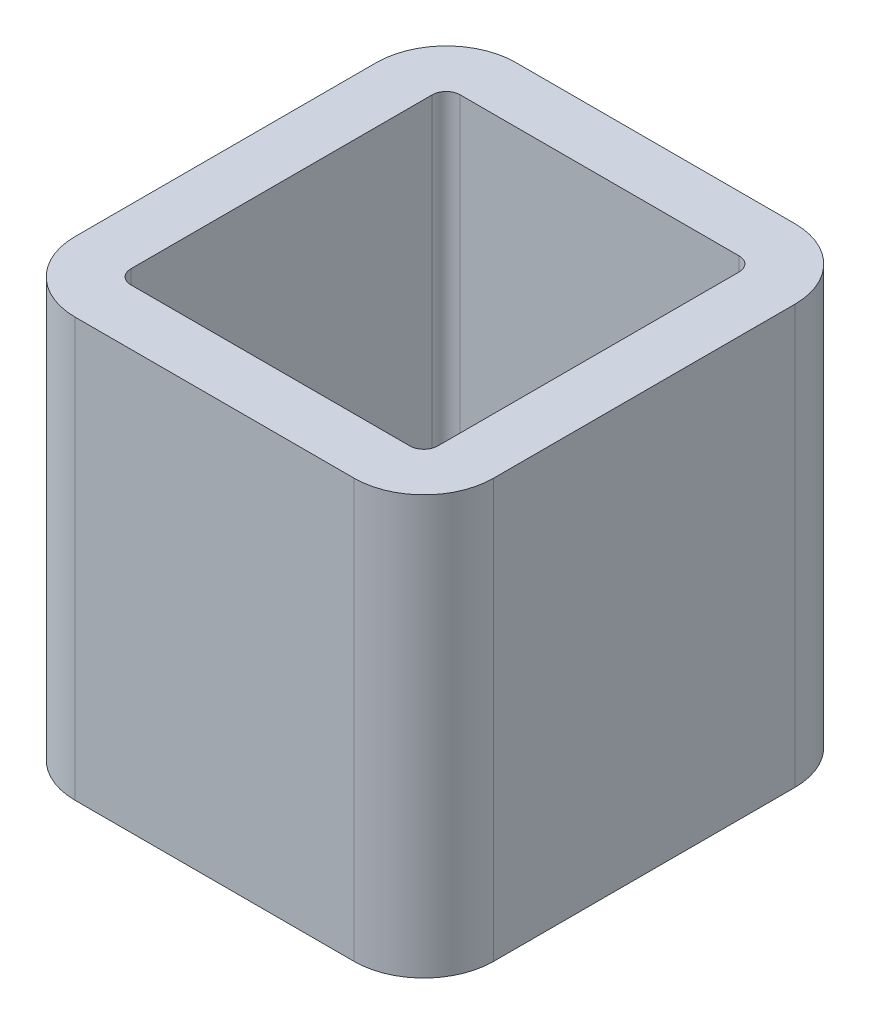
ISO-10303-21;
HEADER;
FILE_DESCRIPTION(('STEP AP214'),'2;1');
FILE_NAME('part.step','',(''),(''),'','','');
FILE_SCHEMA(('AUTOMOTIVE_DESIGN { 1 0 10303 214 1 1 1 1 }'));
ENDSEC;
DATA;
#1=APPLICATION_CONTEXT('core data for automotive mechanical design processes');
#2=APPLICATION_PROTOCOL_DEFINITION('international standard','automotive_design',2000,#1);
#3=PRODUCT_CONTEXT('',#1,'mechanical');
#4=PRODUCT('Part','Part','',(#3));
#5=PRODUCT_RELATED_PRODUCT_CATEGORY('part','',(#4));
#6=PRODUCT_DEFINITION_FORMATION('','',#4);
#7=PRODUCT_DEFINITION_CONTEXT('part definition',#1,'design');
#8=PRODUCT_DEFINITION('design','',#6,#7);
#9=PRODUCT_DEFINITION_SHAPE('','',#8);
#10=(LENGTH_UNIT() NAMED_UNIT(*) SI_UNIT(.MILLI.,.METRE.));
#11=(NAMED_UNIT(*) PLANE_ANGLE_UNIT() SI_UNIT($,.RADIAN.));
#12=(NAMED_UNIT(*) SI_UNIT($,.STERADIAN.) SOLID_ANGLE_UNIT());
#13=UNCERTAINTY_MEASURE_WITH_UNIT(LENGTH_MEASURE(1.E-05),#10,'distance_accuracy_value','');
#14=(GEOMETRIC_REPRESENTATION_CONTEXT(3) GLOBAL_UNCERTAINTY_ASSIGNED_CONTEXT((#13)) GLOBAL_UNIT_ASSIGNED_CONTEXT((#10,
#11,#12)) REPRESENTATION_CONTEXT('',''));
#15=CARTESIAN_POINT('',(0.,0.,0.));
#16=DIRECTION('',(0.,0.,1.));
#17=DIRECTION('',(1.,0.,0.));
#18=AXIS2_PLACEMENT_3D('',#15,#16,#17);
#19=CARTESIAN_POINT('',(0.,0.,0.));
#20=DIRECTION('',(0.,1.,0.));
#21=DIRECTION('',(0.,0.,1.));
#22=AXIS2_PLACEMENT_3D('',#19,#20,#21);
#23=PLANE('',#22);
#24=DIRECTION('',(0.,0.,1.));
#25=VECTOR('',#24,1.);
#26=CARTESIAN_POINT('',(-150.,0.,-158.));
#27=LINE('',#26,#25);
#28=CARTESIAN_POINT('',(-150.,0.,-108.));
#29=VERTEX_POINT('',#28);
#30=CARTESIAN_POINT('',(-150.,0.,108.));
#31=VERTEX_POINT('',#30);
#32=EDGE_CURVE('E254',#29,#31,#27,.T.);
#33=ORIENTED_EDGE('',*,*,#32,.F.);
#34=CARTESIAN_POINT('',(-100.,0.,-108.));
#35=DIRECTION('',(0.,1.,0.));
#36=DIRECTION('',(0.,0.,1.));
#37=AXIS2_PLACEMENT_3D('',#34,#35,#36);
#38=CIRCLE('',#37,50.);
#39=CARTESIAN_POINT('',(-100.,0.,-158.));
#40=VERTEX_POINT('',#39);
#41=EDGE_CURVE('E285',#29,#40,#38,.F.);
#42=ORIENTED_EDGE('',*,*,#41,.T.);
#43=DIRECTION('',(-1.,0.,0.));
#44=VECTOR('',#43,1.);
#45=CARTESIAN_POINT('',(-150.,0.,-158.));
#46=LINE('',#45,#44);
#47=CARTESIAN_POINT('',(100.,0.,-158.));
#48=VERTEX_POINT('',#47);
#49=EDGE_CURVE('E241',#48,#40,#46,.T.);
#50=ORIENTED_EDGE('',*,*,#49,.F.);
#51=CARTESIAN_POINT('',(100.,0.,-108.));
#52=DIRECTION('',(0.,1.,0.));
#53=DIRECTION('',(0.,0.,1.));
#54=AXIS2_PLACEMENT_3D('',#51,#52,#53);
#55=CIRCLE('',#54,50.);
#56=CARTESIAN_POINT('',(150.,0.,-108.));
#57=VERTEX_POINT('',#56);
#58=EDGE_CURVE('E282',#48,#57,#55,.F.);
#59=ORIENTED_EDGE('',*,*,#58,.T.);
#60=DIRECTION('',(0.,0.,-1.));
#61=VECTOR('',#60,1.);
#62=CARTESIAN_POINT('',(150.,0.,-158.));
#63=LINE('',#62,#61);
#64=CARTESIAN_POINT('',(150.,0.,108.));
#65=VERTEX_POINT('',#64);
#66=EDGE_CURVE('E263',#65,#57,#63,.T.);
#67=ORIENTED_EDGE('',*,*,#66,.F.);
#68=CARTESIAN_POINT('',(100.,0.,108.));
#69=DIRECTION('',(0.,1.,0.));
#70=DIRECTION('',(0.,0.,1.));
#71=AXIS2_PLACEMENT_3D('',#68,#69,#70);
#72=CIRCLE('',#71,50.);
#73=CARTESIAN_POINT('',(100.,0.,158.));
#74=VERTEX_POINT('',#73);
#75=EDGE_CURVE('E276',#65,#74,#72,.F.);
#76=ORIENTED_EDGE('',*,*,#75,.T.);
#77=DIRECTION('',(1.,0.,0.));
#78=VECTOR('',#77,1.);
#79=CARTESIAN_POINT('',(-150.,0.,158.));
#80=LINE('',#79,#78);
#81=CARTESIAN_POINT('',(-100.,0.,158.));
#82=VERTEX_POINT('',#81);
#83=EDGE_CURVE('E258',#82,#74,#80,.T.);
#84=ORIENTED_EDGE('',*,*,#83,.F.);
#85=CARTESIAN_POINT('',(-100.,0.,108.));
#86=DIRECTION('',(0.,1.,0.));
#87=DIRECTION('',(0.,0.,1.));
#88=AXIS2_PLACEMENT_3D('',#85,#86,#87);
#89=CIRCLE('',#88,50.);
#90=EDGE_CURVE('E279',#82,#31,#89,.F.);
#91=ORIENTED_EDGE('',*,*,#90,.T.);
#92=EDGE_LOOP('',(#33,#42,#50,#59,#67,#76,#84,#91));
#93=FACE_BOUND('',#92,.T.);
#94=CARTESIAN_POINT('',(-100.,0.,-108.));
#95=DIRECTION('',(0.,1.,0.));
#96=DIRECTION('',(0.,0.,1.));
#97=AXIS2_PLACEMENT_3D('',#94,#95,#96);
#98=CIRCLE('',#97,10.);
#99=CARTESIAN_POINT('',(-110.,0.,-108.));
#100=VERTEX_POINT('',#99);
#101=CARTESIAN_POINT('',(-100.,0.,-118.));
#102=VERTEX_POINT('',#101);
#103=EDGE_CURVE('E215',#100,#102,#98,.F.);
#104=ORIENTED_EDGE('',*,*,#103,.F.);
#105=DIRECTION('',(0.,0.,1.));
#106=VECTOR('',#105,1.);
#107=CARTESIAN_POINT('',(-110.,0.,-158.));
#108=LINE('',#107,#106);
#109=CARTESIAN_POINT('',(-110.,0.,108.));
#110=VERTEX_POINT('',#109);
#111=EDGE_CURVE('E212',#100,#110,#108,.T.);
#112=ORIENTED_EDGE('',*,*,#111,.T.);
#113=CARTESIAN_POINT('',(-100.,0.,108.));
#114=DIRECTION('',(0.,1.,0.));
#115=DIRECTION('',(0.,0.,1.));
#116=AXIS2_PLACEMENT_3D('',#113,#114,#115);
#117=CIRCLE('',#116,10.);
#118=CARTESIAN_POINT('',(-100.,0.,118.));
#119=VERTEX_POINT('',#118);
#120=EDGE_CURVE('E166',#119,#110,#117,.F.);
#121=ORIENTED_EDGE('',*,*,#120,.F.);
#122=DIRECTION('',(1.,0.,0.));
#123=VECTOR('',#122,1.);
#124=CARTESIAN_POINT('',(-150.,0.,118.));
#125=LINE('',#124,#123);
#126=CARTESIAN_POINT('',(100.,0.,118.));
#127=VERTEX_POINT('',#126);
#128=EDGE_CURVE('E67',#119,#127,#125,.T.);
#129=ORIENTED_EDGE('',*,*,#128,.T.);
#130=CARTESIAN_POINT('',(100.,0.,108.));
#131=DIRECTION('',(0.,1.,0.));
#132=DIRECTION('',(0.,0.,1.));
#133=AXIS2_PLACEMENT_3D('',#130,#131,#132);
#134=CIRCLE('',#133,10.);
#135=CARTESIAN_POINT('',(110.,0.,108.));
#136=VERTEX_POINT('',#135);
#137=EDGE_CURVE('E229',#136,#127,#134,.F.);
#138=ORIENTED_EDGE('',*,*,#137,.F.);
#139=DIRECTION('',(0.,0.,-1.));
#140=VECTOR('',#139,1.);
#141=CARTESIAN_POINT('',(110.,0.,-158.));
#142=LINE('',#141,#140);
#143=CARTESIAN_POINT('',(110.,0.,-108.));
#144=VERTEX_POINT('',#143);
#145=EDGE_CURVE('E223',#136,#144,#142,.T.);
#146=ORIENTED_EDGE('',*,*,#145,.T.);
#147=CARTESIAN_POINT('',(100.,0.,-108.));
#148=DIRECTION('',(0.,1.,0.));
#149=DIRECTION('',(0.,0.,1.));
#150=AXIS2_PLACEMENT_3D('',#147,#148,#149);
#151=CIRCLE('',#150,10.);
#152=CARTESIAN_POINT('',(100.,0.,-118.));
#153=VERTEX_POINT('',#152);
#154=EDGE_CURVE('E219',#153,#144,#151,.F.);
#155=ORIENTED_EDGE('',*,*,#154,.F.);
#156=DIRECTION('',(-1.,0.,0.));
#157=VECTOR('',#156,1.);
#158=CARTESIAN_POINT('',(-150.,0.,-118.));
#159=LINE('',#158,#157);
#160=EDGE_CURVE('E182',#153,#102,#159,.T.);
#161=ORIENTED_EDGE('',*,*,#160,.T.);
#162=EDGE_LOOP('',(#104,#112,#121,#129,#138,#146,#155,#161));
#163=FACE_BOUND('',#162,.T.);
#164=ADVANCED_FACE('F43',(#93,#163),#23,.F.);
#165=CARTESIAN_POINT('',(-150.,300.,-158.));
#166=DIRECTION('',(1.,0.,0.));
#167=DIRECTION('',(0.,0.,-1.));
#168=AXIS2_PLACEMENT_3D('',#165,#166,#167);
#169=PLANE('',#168);
#170=DIRECTION('',(0.,0.,1.));
#171=VECTOR('',#170,1.);
#172=CARTESIAN_POINT('',(-150.,300.,-158.));
#173=LINE('',#172,#171);
#174=CARTESIAN_POINT('',(-150.,300.,-108.));
#175=VERTEX_POINT('',#174);
#176=CARTESIAN_POINT('',(-150.,300.,108.));
#177=VERTEX_POINT('',#176);
#178=EDGE_CURVE('E236',#175,#177,#173,.T.);
#179=ORIENTED_EDGE('',*,*,#178,.F.);
#180=DIRECTION('',(0.,-1.,0.));
#181=VECTOR('',#180,1.);
#182=CARTESIAN_POINT('',(-150.,300.,-108.));
#183=LINE('',#182,#181);
#184=EDGE_CURVE('E272',#175,#29,#183,.T.);
#185=ORIENTED_EDGE('',*,*,#184,.T.);
#186=ORIENTED_EDGE('',*,*,#32,.T.);
#187=DIRECTION('',(0.,-1.,0.));
#188=VECTOR('',#187,1.);
#189=CARTESIAN_POINT('',(-150.,300.,108.));
#190=LINE('',#189,#188);
#191=EDGE_CURVE('E253',#31,#177,#190,.F.);
#192=ORIENTED_EDGE('',*,*,#191,.T.);
#193=EDGE_LOOP('',(#179,#185,#186,#192));
#194=FACE_BOUND('',#193,.T.);
#195=ADVANCED_FACE('F347',(#194),#169,.F.);
#196=CARTESIAN_POINT('',(-150.,300.,158.));
#197=DIRECTION('',(0.,0.,-1.));
#198=DIRECTION('',(-1.,0.,0.));
#199=AXIS2_PLACEMENT_3D('',#196,#197,#198);
#200=PLANE('',#199);
#201=DIRECTION('',(1.,0.,0.));
#202=VECTOR('',#201,1.);
#203=CARTESIAN_POINT('',(-150.,300.,158.));
#204=LINE('',#203,#202);
#205=CARTESIAN_POINT('',(-100.,300.,158.));
#206=VERTEX_POINT('',#205);
#207=CARTESIAN_POINT('',(100.,300.,158.));
#208=VERTEX_POINT('',#207);
#209=EDGE_CURVE('E240',#206,#208,#204,.T.);
#210=ORIENTED_EDGE('',*,*,#209,.F.);
#211=DIRECTION('',(0.,-1.,0.));
#212=VECTOR('',#211,1.);
#213=CARTESIAN_POINT('',(-100.,300.,158.));
#214=LINE('',#213,#212);
#215=EDGE_CURVE('E11',#206,#82,#214,.T.);
#216=ORIENTED_EDGE('',*,*,#215,.T.);
#217=ORIENTED_EDGE('',*,*,#83,.T.);
#218=DIRECTION('',(0.,-1.,0.));
#219=VECTOR('',#218,1.);
#220=CARTESIAN_POINT('',(100.,300.,158.));
#221=LINE('',#220,#219);
#222=EDGE_CURVE('E52',#74,#208,#221,.F.);
#223=ORIENTED_EDGE('',*,*,#222,.T.);
#224=EDGE_LOOP('',(#210,#216,#217,#223));
#225=FACE_BOUND('',#224,.T.);
#226=ADVANCED_FACE('F317',(#225),#200,.F.);
#227=CARTESIAN_POINT('',(150.,300.,-158.));
#228=DIRECTION('',(-1.,0.,0.));
#229=DIRECTION('',(0.,0.,1.));
#230=AXIS2_PLACEMENT_3D('',#227,#228,#229);
#231=PLANE('',#230);
#232=ORIENTED_EDGE('',*,*,#66,.T.);
#233=DIRECTION('',(0.,-1.,0.));
#234=VECTOR('',#233,1.);
#235=CARTESIAN_POINT('',(150.,300.,-108.));
#236=LINE('',#235,#234);
#237=CARTESIAN_POINT('',(150.,300.,-108.));
#238=VERTEX_POINT('',#237);
#239=EDGE_CURVE('E311',#57,#238,#236,.F.);
#240=ORIENTED_EDGE('',*,*,#239,.T.);
#241=DIRECTION('',(0.,0.,-1.));
#242=VECTOR('',#241,1.);
#243=CARTESIAN_POINT('',(150.,300.,-158.));
#244=LINE('',#243,#242);
#245=CARTESIAN_POINT('',(150.,300.,108.));
#246=VERTEX_POINT('',#245);
#247=EDGE_CURVE('E245',#246,#238,#244,.T.);
#248=ORIENTED_EDGE('',*,*,#247,.F.);
#249=DIRECTION('',(0.,-1.,0.));
#250=VECTOR('',#249,1.);
#251=CARTESIAN_POINT('',(150.,300.,108.));
#252=LINE('',#251,#250);
#253=EDGE_CURVE('E307',#246,#65,#252,.T.);
#254=ORIENTED_EDGE('',*,*,#253,.T.);
#255=EDGE_LOOP('',(#232,#240,#248,#254));
#256=FACE_BOUND('',#255,.T.);
#257=ADVANCED_FACE('F327',(#256),#231,.F.);
#258=CARTESIAN_POINT('',(-150.,300.,-158.));
#259=DIRECTION('',(0.,0.,1.));
#260=DIRECTION('',(1.,0.,0.));
#261=AXIS2_PLACEMENT_3D('',#258,#259,#260);
#262=PLANE('',#261);
#263=ORIENTED_EDGE('',*,*,#49,.T.);
#264=DIRECTION('',(0.,-1.,0.));
#265=VECTOR('',#264,1.);
#266=CARTESIAN_POINT('',(-100.,300.,-158.));
#267=LINE('',#266,#265);
#268=CARTESIAN_POINT('',(-100.,300.,-158.));
#269=VERTEX_POINT('',#268);
#270=EDGE_CURVE('E292',#40,#269,#267,.F.);
#271=ORIENTED_EDGE('',*,*,#270,.T.);
#272=DIRECTION('',(-1.,0.,0.));
#273=VECTOR('',#272,1.);
#274=CARTESIAN_POINT('',(-150.,300.,-158.));
#275=LINE('',#274,#273);
#276=CARTESIAN_POINT('',(100.,300.,-158.));
#277=VERTEX_POINT('',#276);
#278=EDGE_CURVE('E249',#277,#269,#275,.T.);
#279=ORIENTED_EDGE('',*,*,#278,.F.);
#280=DIRECTION('',(0.,-1.,0.));
#281=VECTOR('',#280,1.);
#282=CARTESIAN_POINT('',(100.,300.,-158.));
#283=LINE('',#282,#281);
#284=EDGE_CURVE('E288',#277,#48,#283,.T.);
#285=ORIENTED_EDGE('',*,*,#284,.T.);
#286=EDGE_LOOP('',(#263,#271,#279,#285));
#287=FACE_BOUND('',#286,.T.);
#288=ADVANCED_FACE('F339',(#287),#262,.F.);
#289=CARTESIAN_POINT('',(0.,300.,0.));
#290=DIRECTION('',(0.,1.,0.));
#291=DIRECTION('',(0.,0.,1.));
#292=AXIS2_PLACEMENT_3D('',#289,#290,#291);
#293=PLANE('',#292);
#294=DIRECTION('',(-1.,0.,0.));
#295=VECTOR('',#294,1.);
#296=CARTESIAN_POINT('',(-150.,300.,-118.));
#297=LINE('',#296,#295);
#298=CARTESIAN_POINT('',(100.,300.,-118.));
#299=VERTEX_POINT('',#298);
#300=CARTESIAN_POINT('',(-100.,300.,-118.));
#301=VERTEX_POINT('',#300);
#302=EDGE_CURVE('E172',#299,#301,#297,.T.);
#303=ORIENTED_EDGE('',*,*,#302,.F.);
#304=CARTESIAN_POINT('',(100.,300.,-108.));
#305=DIRECTION('',(0.,1.,0.));
#306=DIRECTION('',(0.,0.,1.));
#307=AXIS2_PLACEMENT_3D('',#304,#305,#306);
#308=CIRCLE('',#307,10.);
#309=CARTESIAN_POINT('',(110.,300.,-108.));
#310=VERTEX_POINT('',#309);
#311=EDGE_CURVE('E191',#310,#299,#308,.T.);
#312=ORIENTED_EDGE('',*,*,#311,.F.);
#313=DIRECTION('',(0.,0.,-1.));
#314=VECTOR('',#313,1.);
#315=CARTESIAN_POINT('',(110.,300.,-158.));
#316=LINE('',#315,#314);
#317=CARTESIAN_POINT('',(110.,300.,108.));
#318=VERTEX_POINT('',#317);
#319=EDGE_CURVE('E59',#318,#310,#316,.T.);
#320=ORIENTED_EDGE('',*,*,#319,.F.);
#321=CARTESIAN_POINT('',(100.,300.,108.));
#322=DIRECTION('',(0.,1.,0.));
#323=DIRECTION('',(0.,0.,1.));
#324=AXIS2_PLACEMENT_3D('',#321,#322,#323);
#325=CIRCLE('',#324,10.);
#326=CARTESIAN_POINT('',(100.,300.,118.));
#327=VERTEX_POINT('',#326);
#328=EDGE_CURVE('E192',#327,#318,#325,.T.);
#329=ORIENTED_EDGE('',*,*,#328,.F.);
#330=DIRECTION('',(1.,0.,0.));
#331=VECTOR('',#330,1.);
#332=CARTESIAN_POINT('',(-150.,300.,118.));
#333=LINE('',#332,#331);
#334=CARTESIAN_POINT('',(-100.,300.,118.));
#335=VERTEX_POINT('',#334);
#336=EDGE_CURVE('E181',#335,#327,#333,.T.);
#337=ORIENTED_EDGE('',*,*,#336,.F.);
#338=CARTESIAN_POINT('',(-100.,300.,108.));
#339=DIRECTION('',(0.,1.,0.));
#340=DIRECTION('',(0.,0.,1.));
#341=AXIS2_PLACEMENT_3D('',#338,#339,#340);
#342=CIRCLE('',#341,10.);
#343=CARTESIAN_POINT('',(-110.,300.,108.));
#344=VERTEX_POINT('',#343);
#345=EDGE_CURVE('E164',#344,#335,#342,.T.);
#346=ORIENTED_EDGE('',*,*,#345,.F.);
#347=DIRECTION('',(0.,0.,1.));
#348=VECTOR('',#347,1.);
#349=CARTESIAN_POINT('',(-110.,300.,-158.));
#350=LINE('',#349,#348);
#351=CARTESIAN_POINT('',(-110.,300.,-108.));
#352=VERTEX_POINT('',#351);
#353=EDGE_CURVE('E176',#352,#344,#350,.T.);
#354=ORIENTED_EDGE('',*,*,#353,.F.);
#355=CARTESIAN_POINT('',(-100.,300.,-108.));
#356=DIRECTION('',(0.,1.,0.));
#357=DIRECTION('',(0.,0.,1.));
#358=AXIS2_PLACEMENT_3D('',#355,#356,#357);
#359=CIRCLE('',#358,10.);
#360=EDGE_CURVE('E196',#301,#352,#359,.T.);
#361=ORIENTED_EDGE('',*,*,#360,.F.);
#362=EDGE_LOOP('',(#303,#312,#320,#329,#337,#346,#354,#361));
#363=FACE_BOUND('',#362,.T.);
#364=ORIENTED_EDGE('',*,*,#278,.T.);
#365=CARTESIAN_POINT('',(-100.,300.,-108.));
#366=DIRECTION('',(0.,1.,0.));
#367=DIRECTION('',(0.,0.,1.));
#368=AXIS2_PLACEMENT_3D('',#365,#366,#367);
#369=CIRCLE('',#368,50.);
#370=EDGE_CURVE('E304',#269,#175,#369,.T.);
#371=ORIENTED_EDGE('',*,*,#370,.T.);
#372=ORIENTED_EDGE('',*,*,#178,.T.);
#373=CARTESIAN_POINT('',(-100.,300.,108.));
#374=DIRECTION('',(0.,1.,0.));
#375=DIRECTION('',(0.,0.,1.));
#376=AXIS2_PLACEMENT_3D('',#373,#374,#375);
#377=CIRCLE('',#376,50.);
#378=EDGE_CURVE('E298',#177,#206,#377,.T.);
#379=ORIENTED_EDGE('',*,*,#378,.T.);
#380=ORIENTED_EDGE('',*,*,#209,.T.);
#381=CARTESIAN_POINT('',(100.,300.,108.));
#382=DIRECTION('',(0.,1.,0.));
#383=DIRECTION('',(0.,0.,1.));
#384=AXIS2_PLACEMENT_3D('',#381,#382,#383);
#385=CIRCLE('',#384,50.);
#386=EDGE_CURVE('E295',#208,#246,#385,.T.);
#387=ORIENTED_EDGE('',*,*,#386,.T.);
#388=ORIENTED_EDGE('',*,*,#247,.T.);
#389=CARTESIAN_POINT('',(100.,300.,-108.));
#390=DIRECTION('',(0.,1.,0.));
#391=DIRECTION('',(0.,0.,1.));
#392=AXIS2_PLACEMENT_3D('',#389,#390,#391);
#393=CIRCLE('',#392,50.);
#394=EDGE_CURVE('E301',#238,#277,#393,.T.);
#395=ORIENTED_EDGE('',*,*,#394,.T.);
#396=EDGE_LOOP('',(#364,#371,#372,#379,#380,#387,#388,#395));
#397=FACE_BOUND('',#396,.T.);
#398=ADVANCED_FACE('F186',(#363,#397),#293,.T.);
#399=CARTESIAN_POINT('',(-100.,300.,-108.));
#400=DIRECTION('',(0.,-1.,0.));
#401=DIRECTION('',(0.,0.,-1.));
#402=AXIS2_PLACEMENT_3D('',#399,#400,#401);
#403=CYLINDRICAL_SURFACE('',#402,50.);
#404=ORIENTED_EDGE('',*,*,#370,.F.);
#405=ORIENTED_EDGE('',*,*,#270,.F.);
#406=ORIENTED_EDGE('',*,*,#41,.F.);
#407=ORIENTED_EDGE('',*,*,#184,.F.);
#408=EDGE_LOOP('',(#404,#405,#406,#407));
#409=FACE_BOUND('',#408,.T.);
#410=ADVANCED_FACE('F345',(#409),#403,.T.);
#411=CARTESIAN_POINT('',(100.,300.,-108.));
#412=DIRECTION('',(0.,-1.,0.));
#413=DIRECTION('',(0.,0.,-1.));
#414=AXIS2_PLACEMENT_3D('',#411,#412,#413);
#415=CYLINDRICAL_SURFACE('',#414,50.);
#416=ORIENTED_EDGE('',*,*,#394,.F.);
#417=ORIENTED_EDGE('',*,*,#239,.F.);
#418=ORIENTED_EDGE('',*,*,#58,.F.);
#419=ORIENTED_EDGE('',*,*,#284,.F.);
#420=EDGE_LOOP('',(#416,#417,#418,#419));
#421=FACE_BOUND('',#420,.T.);
#422=ADVANCED_FACE('F336',(#421),#415,.T.);
#423=CARTESIAN_POINT('',(-100.,300.,108.));
#424=DIRECTION('',(0.,-1.,0.));
#425=DIRECTION('',(0.,0.,-1.));
#426=AXIS2_PLACEMENT_3D('',#423,#424,#425);
#427=CYLINDRICAL_SURFACE('',#426,50.);
#428=ORIENTED_EDGE('',*,*,#378,.F.);
#429=ORIENTED_EDGE('',*,*,#191,.F.);
#430=ORIENTED_EDGE('',*,*,#90,.F.);
#431=ORIENTED_EDGE('',*,*,#215,.F.);
#432=EDGE_LOOP('',(#428,#429,#430,#431));
#433=FACE_BOUND('',#432,.T.);
#434=ADVANCED_FACE('F350',(#433),#427,.T.);
#435=CARTESIAN_POINT('',(100.,300.,108.));
#436=DIRECTION('',(0.,-1.,0.));
#437=DIRECTION('',(0.,0.,-1.));
#438=AXIS2_PLACEMENT_3D('',#435,#436,#437);
#439=CYLINDRICAL_SURFACE('',#438,50.);
#440=ORIENTED_EDGE('',*,*,#386,.F.);
#441=ORIENTED_EDGE('',*,*,#222,.F.);
#442=ORIENTED_EDGE('',*,*,#75,.F.);
#443=ORIENTED_EDGE('',*,*,#253,.F.);
#444=EDGE_LOOP('',(#440,#441,#442,#443));
#445=FACE_BOUND('',#444,.T.);
#446=ADVANCED_FACE('F45',(#445),#439,.T.);
#447=CARTESIAN_POINT('',(-110.,300.,-158.));
#448=DIRECTION('',(1.,0.,0.));
#449=DIRECTION('',(0.,0.,-1.));
#450=AXIS2_PLACEMENT_3D('',#447,#448,#449);
#451=PLANE('',#450);
#452=ORIENTED_EDGE('',*,*,#353,.T.);
#453=DIRECTION('',(0.,1.,0.));
#454=VECTOR('',#453,1.);
#455=CARTESIAN_POINT('',(-110.,300.,108.));
#456=LINE('',#455,#454);
#457=EDGE_CURVE('E160',#110,#344,#456,.T.);
#458=ORIENTED_EDGE('',*,*,#457,.F.);
#459=ORIENTED_EDGE('',*,*,#111,.F.);
#460=DIRECTION('',(0.,1.,0.));
#461=VECTOR('',#460,1.);
#462=CARTESIAN_POINT('',(-110.,300.,-108.));
#463=LINE('',#462,#461);
#464=EDGE_CURVE('E171',#352,#100,#463,.F.);
#465=ORIENTED_EDGE('',*,*,#464,.F.);
#466=EDGE_LOOP('',(#452,#458,#459,#465));
#467=FACE_BOUND('',#466,.T.);
#468=ADVANCED_FACE('F177',(#467),#451,.T.);
#469=CARTESIAN_POINT('',(-150.,300.,118.));
#470=DIRECTION('',(0.,0.,-1.));
#471=DIRECTION('',(-1.,0.,0.));
#472=AXIS2_PLACEMENT_3D('',#469,#470,#471);
#473=PLANE('',#472);
#474=ORIENTED_EDGE('',*,*,#336,.T.);
#475=DIRECTION('',(0.,1.,0.));
#476=VECTOR('',#475,1.);
#477=CARTESIAN_POINT('',(100.,300.,118.));
#478=LINE('',#477,#476);
#479=EDGE_CURVE('E538',#127,#327,#478,.T.);
#480=ORIENTED_EDGE('',*,*,#479,.F.);
#481=ORIENTED_EDGE('',*,*,#128,.F.);
#482=DIRECTION('',(0.,1.,0.));
#483=VECTOR('',#482,1.);
#484=CARTESIAN_POINT('',(-100.,300.,118.));
#485=LINE('',#484,#483);
#486=EDGE_CURVE('E259',#335,#119,#485,.F.);
#487=ORIENTED_EDGE('',*,*,#486,.F.);
#488=EDGE_LOOP('',(#474,#480,#481,#487));
#489=FACE_BOUND('',#488,.T.);
#490=ADVANCED_FACE('F454',(#489),#473,.T.);
#491=CARTESIAN_POINT('',(110.,300.,-158.));
#492=DIRECTION('',(-1.,0.,0.));
#493=DIRECTION('',(0.,0.,1.));
#494=AXIS2_PLACEMENT_3D('',#491,#492,#493);
#495=PLANE('',#494);
#496=ORIENTED_EDGE('',*,*,#145,.F.);
#497=DIRECTION('',(0.,1.,0.));
#498=VECTOR('',#497,1.);
#499=CARTESIAN_POINT('',(110.,300.,108.));
#500=LINE('',#499,#498);
#501=EDGE_CURVE('E211',#318,#136,#500,.F.);
#502=ORIENTED_EDGE('',*,*,#501,.F.);
#503=ORIENTED_EDGE('',*,*,#319,.T.);
#504=DIRECTION('',(0.,1.,0.));
#505=VECTOR('',#504,1.);
#506=CARTESIAN_POINT('',(110.,300.,-108.));
#507=LINE('',#506,#505);
#508=EDGE_CURVE('E541',#144,#310,#507,.T.);
#509=ORIENTED_EDGE('',*,*,#508,.F.);
#510=EDGE_LOOP('',(#496,#502,#503,#509));
#511=FACE_BOUND('',#510,.T.);
#512=ADVANCED_FACE('F464',(#511),#495,.T.);
#513=CARTESIAN_POINT('',(-150.,300.,-118.));
#514=DIRECTION('',(0.,0.,1.));
#515=DIRECTION('',(1.,0.,0.));
#516=AXIS2_PLACEMENT_3D('',#513,#514,#515);
#517=PLANE('',#516);
#518=ORIENTED_EDGE('',*,*,#160,.F.);
#519=DIRECTION('',(0.,1.,0.));
#520=VECTOR('',#519,1.);
#521=CARTESIAN_POINT('',(100.,300.,-118.));
#522=LINE('',#521,#520);
#523=EDGE_CURVE('E218',#299,#153,#522,.F.);
#524=ORIENTED_EDGE('',*,*,#523,.F.);
#525=ORIENTED_EDGE('',*,*,#302,.T.);
#526=DIRECTION('',(0.,1.,0.));
#527=VECTOR('',#526,1.);
#528=CARTESIAN_POINT('',(-100.,300.,-118.));
#529=LINE('',#528,#527);
#530=EDGE_CURVE('E198',#102,#301,#529,.T.);
#531=ORIENTED_EDGE('',*,*,#530,.F.);
#532=EDGE_LOOP('',(#518,#524,#525,#531));
#533=FACE_BOUND('',#532,.T.);
#534=ADVANCED_FACE('F474',(#533),#517,.T.);
#535=CARTESIAN_POINT('',(-100.,300.,-108.));
#536=DIRECTION('',(0.,-1.,0.));
#537=DIRECTION('',(0.,0.,-1.));
#538=AXIS2_PLACEMENT_3D('',#535,#536,#537);
#539=CYLINDRICAL_SURFACE('',#538,10.);
#540=ORIENTED_EDGE('',*,*,#360,.T.);
#541=ORIENTED_EDGE('',*,*,#464,.T.);
#542=ORIENTED_EDGE('',*,*,#103,.T.);
#543=ORIENTED_EDGE('',*,*,#530,.T.);
#544=EDGE_LOOP('',(#540,#541,#542,#543));
#545=FACE_BOUND('',#544,.T.);
#546=ADVANCED_FACE('F484',(#545),#539,.F.);
#547=CARTESIAN_POINT('',(100.,300.,-108.));
#548=DIRECTION('',(0.,-1.,0.));
#549=DIRECTION('',(0.,0.,-1.));
#550=AXIS2_PLACEMENT_3D('',#547,#548,#549);
#551=CYLINDRICAL_SURFACE('',#550,10.);
#552=ORIENTED_EDGE('',*,*,#311,.T.);
#553=ORIENTED_EDGE('',*,*,#523,.T.);
#554=ORIENTED_EDGE('',*,*,#154,.T.);
#555=ORIENTED_EDGE('',*,*,#508,.T.);
#556=EDGE_LOOP('',(#552,#553,#554,#555));
#557=FACE_BOUND('',#556,.T.);
#558=ADVANCED_FACE('F495',(#557),#551,.F.);
#559=CARTESIAN_POINT('',(-100.,300.,108.));
#560=DIRECTION('',(0.,-1.,0.));
#561=DIRECTION('',(0.,0.,-1.));
#562=AXIS2_PLACEMENT_3D('',#559,#560,#561);
#563=CYLINDRICAL_SURFACE('',#562,10.);
#564=ORIENTED_EDGE('',*,*,#345,.T.);
#565=ORIENTED_EDGE('',*,*,#486,.T.);
#566=ORIENTED_EDGE('',*,*,#120,.T.);
#567=ORIENTED_EDGE('',*,*,#457,.T.);
#568=EDGE_LOOP('',(#564,#565,#566,#567));
#569=FACE_BOUND('',#568,.T.);
#570=ADVANCED_FACE('F162',(#569),#563,.F.);
#571=CARTESIAN_POINT('',(100.,300.,108.));
#572=DIRECTION('',(0.,-1.,0.));
#573=DIRECTION('',(0.,0.,-1.));
#574=AXIS2_PLACEMENT_3D('',#571,#572,#573);
#575=CYLINDRICAL_SURFACE('',#574,10.);
#576=ORIENTED_EDGE('',*,*,#328,.T.);
#577=ORIENTED_EDGE('',*,*,#501,.T.);
#578=ORIENTED_EDGE('',*,*,#137,.T.);
#579=ORIENTED_EDGE('',*,*,#479,.T.);
#580=EDGE_LOOP('',(#576,#577,#578,#579));
#581=FACE_BOUND('',#580,.T.);
#582=ADVANCED_FACE('F516',(#581),#575,.F.);
#583=CLOSED_SHELL('',(#164,#195,#226,#257,#288,#398,#410,#422,#434,#446,#468,#490,#512,#534,
#546,#558,#570,#582));
#584=MANIFOLD_SOLID_BREP('B2',#583);
#585=ADVANCED_BREP_SHAPE_REPRESENTATION('',(#18,#584),#14);
#586=SHAPE_DEFINITION_REPRESENTATION(#9,#585);
ENDSEC;
END-ISO-10303-21;
